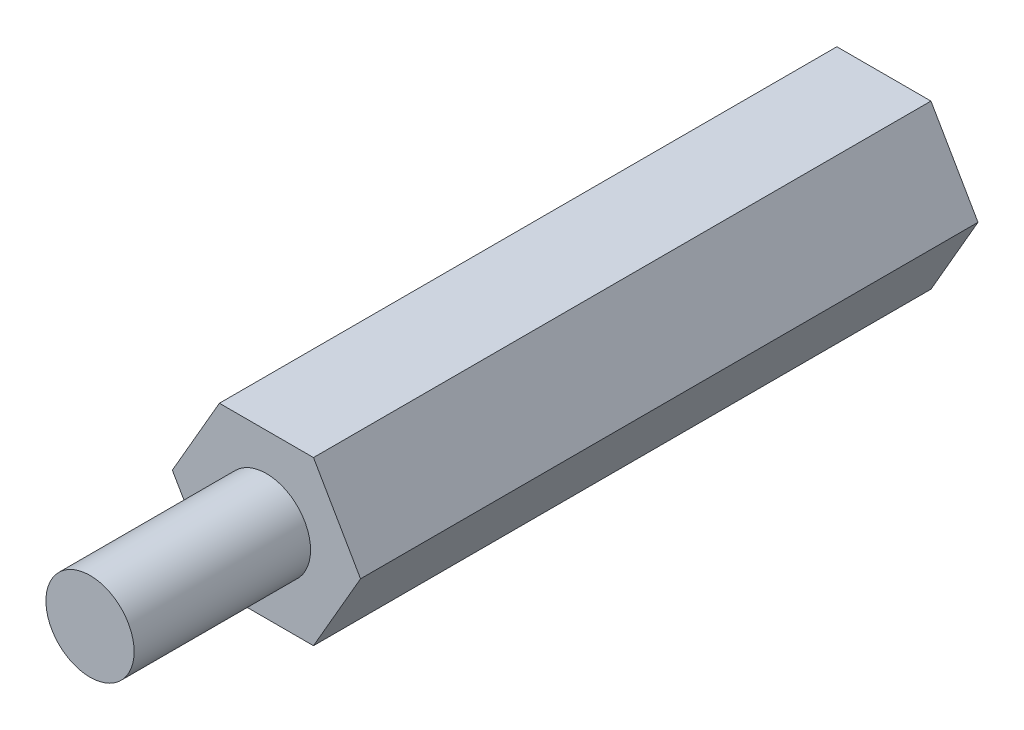
ISO-10303-21;
HEADER;
FILE_DESCRIPTION(('STEP AP214'),'2;1');
FILE_NAME('part.step','',(''),(''),'','','');
FILE_SCHEMA(('AUTOMOTIVE_DESIGN { 1 0 10303 214 1 1 1 1 }'));
ENDSEC;
DATA;
#1=APPLICATION_CONTEXT('core data for automotive mechanical design processes');
#2=APPLICATION_PROTOCOL_DEFINITION('international standard','automotive_design',2000,#1);
#3=PRODUCT_CONTEXT('',#1,'mechanical');
#4=PRODUCT('Part','Part','',(#3));
#5=PRODUCT_RELATED_PRODUCT_CATEGORY('part','',(#4));
#6=PRODUCT_DEFINITION_FORMATION('','',#4);
#7=PRODUCT_DEFINITION_CONTEXT('part definition',#1,'design');
#8=PRODUCT_DEFINITION('design','',#6,#7);
#9=PRODUCT_DEFINITION_SHAPE('','',#8);
#10=(LENGTH_UNIT() NAMED_UNIT(*) SI_UNIT(.MILLI.,.METRE.));
#11=(NAMED_UNIT(*) PLANE_ANGLE_UNIT() SI_UNIT($,.RADIAN.));
#12=(NAMED_UNIT(*) SI_UNIT($,.STERADIAN.) SOLID_ANGLE_UNIT());
#13=UNCERTAINTY_MEASURE_WITH_UNIT(LENGTH_MEASURE(1.E-05),#10,'distance_accuracy_value','');
#14=(GEOMETRIC_REPRESENTATION_CONTEXT(3) GLOBAL_UNCERTAINTY_ASSIGNED_CONTEXT((#13)) GLOBAL_UNIT_ASSIGNED_CONTEXT((#10,
#11,#12)) REPRESENTATION_CONTEXT('',''));
#15=CARTESIAN_POINT('',(0.,0.,0.));
#16=DIRECTION('',(0.,0.,1.));
#17=DIRECTION('',(1.,0.,0.));
#18=AXIS2_PLACEMENT_3D('',#15,#16,#17);
#19=CARTESIAN_POINT('',(3.2,0.,21.));
#20=DIRECTION('',(-0.866025403784439,-0.5,0.));
#21=DIRECTION('',(0.5,-0.866025403784439,0.));
#22=AXIS2_PLACEMENT_3D('',#19,#20,#21);
#23=PLANE('',#22);
#24=DIRECTION('',(-0.5,0.866025403784439,0.));
#25=VECTOR('',#24,1.);
#26=CARTESIAN_POINT('',(3.2,0.,0.));
#27=LINE('',#26,#25);
#28=CARTESIAN_POINT('',(3.2,0.,0.));
#29=VERTEX_POINT('',#28);
#30=CARTESIAN_POINT('',(1.6,2.7712812921102,0.));
#31=VERTEX_POINT('',#30);
#32=EDGE_CURVE('E120',#29,#31,#27,.T.);
#33=ORIENTED_EDGE('',*,*,#32,.T.);
#34=DIRECTION('',(0.,0.,-1.));
#35=VECTOR('',#34,1.);
#36=CARTESIAN_POINT('',(1.6,2.7712812921102,21.));
#37=LINE('',#36,#35);
#38=CARTESIAN_POINT('',(1.6,2.7712812921102,21.));
#39=VERTEX_POINT('',#38);
#40=EDGE_CURVE('E37',#39,#31,#37,.T.);
#41=ORIENTED_EDGE('',*,*,#40,.F.);
#42=DIRECTION('',(-0.5,0.866025403784439,0.));
#43=VECTOR('',#42,1.);
#44=CARTESIAN_POINT('',(3.2,0.,21.));
#45=LINE('',#44,#43);
#46=CARTESIAN_POINT('',(3.2,0.,21.));
#47=VERTEX_POINT('',#46);
#48=EDGE_CURVE('E131',#47,#39,#45,.T.);
#49=ORIENTED_EDGE('',*,*,#48,.F.);
#50=DIRECTION('',(0.,0.,-1.));
#51=VECTOR('',#50,1.);
#52=CARTESIAN_POINT('',(3.2,0.,21.));
#53=LINE('',#52,#51);
#54=EDGE_CURVE('E116',#47,#29,#53,.T.);
#55=ORIENTED_EDGE('',*,*,#54,.T.);
#56=EDGE_LOOP('',(#33,#41,#49,#55));
#57=FACE_BOUND('',#56,.T.);
#58=ADVANCED_FACE('F34',(#57),#23,.F.);
#59=CARTESIAN_POINT('',(1.6,2.7712812921102,21.));
#60=DIRECTION('',(0.,-1.,0.));
#61=DIRECTION('',(1.,0.,0.));
#62=AXIS2_PLACEMENT_3D('',#59,#60,#61);
#63=PLANE('',#62);
#64=DIRECTION('',(-1.,0.,0.));
#65=VECTOR('',#64,1.);
#66=CARTESIAN_POINT('',(1.6,2.7712812921102,0.));
#67=LINE('',#66,#65);
#68=CARTESIAN_POINT('',(-1.6,2.77128129211021,0.));
#69=VERTEX_POINT('',#68);
#70=EDGE_CURVE('E123',#31,#69,#67,.T.);
#71=ORIENTED_EDGE('',*,*,#70,.T.);
#72=DIRECTION('',(0.,0.,-1.));
#73=VECTOR('',#72,1.);
#74=CARTESIAN_POINT('',(-1.6,2.77128129211021,21.));
#75=LINE('',#74,#73);
#76=CARTESIAN_POINT('',(-1.6,2.77128129211021,21.));
#77=VERTEX_POINT('',#76);
#78=EDGE_CURVE('E134',#77,#69,#75,.T.);
#79=ORIENTED_EDGE('',*,*,#78,.F.);
#80=DIRECTION('',(-1.,0.,0.));
#81=VECTOR('',#80,1.);
#82=CARTESIAN_POINT('',(1.6,2.7712812921102,21.));
#83=LINE('',#82,#81);
#84=EDGE_CURVE('E89',#39,#77,#83,.T.);
#85=ORIENTED_EDGE('',*,*,#84,.F.);
#86=ORIENTED_EDGE('',*,*,#40,.T.);
#87=EDGE_LOOP('',(#71,#79,#85,#86));
#88=FACE_BOUND('',#87,.T.);
#89=ADVANCED_FACE('F139',(#88),#63,.F.);
#90=CARTESIAN_POINT('',(-1.6,2.77128129211021,21.));
#91=DIRECTION('',(0.866025403784439,-0.5,0.));
#92=DIRECTION('',(0.5,0.866025403784439,0.));
#93=AXIS2_PLACEMENT_3D('',#90,#91,#92);
#94=PLANE('',#93);
#95=DIRECTION('',(-0.5,-0.866025403784439,0.));
#96=VECTOR('',#95,1.);
#97=CARTESIAN_POINT('',(-1.6,2.77128129211021,0.));
#98=LINE('',#97,#96);
#99=CARTESIAN_POINT('',(-3.2,0.,0.));
#100=VERTEX_POINT('',#99);
#101=EDGE_CURVE('E126',#69,#100,#98,.T.);
#102=ORIENTED_EDGE('',*,*,#101,.T.);
#103=DIRECTION('',(0.,0.,-1.));
#104=VECTOR('',#103,1.);
#105=CARTESIAN_POINT('',(-3.2,0.,21.));
#106=LINE('',#105,#104);
#107=CARTESIAN_POINT('',(-3.2,0.,21.));
#108=VERTEX_POINT('',#107);
#109=EDGE_CURVE('E111',#108,#100,#106,.T.);
#110=ORIENTED_EDGE('',*,*,#109,.F.);
#111=DIRECTION('',(-0.5,-0.866025403784439,0.));
#112=VECTOR('',#111,1.);
#113=CARTESIAN_POINT('',(-1.6,2.77128129211021,21.));
#114=LINE('',#113,#112);
#115=EDGE_CURVE('E102',#77,#108,#114,.T.);
#116=ORIENTED_EDGE('',*,*,#115,.F.);
#117=ORIENTED_EDGE('',*,*,#78,.T.);
#118=EDGE_LOOP('',(#102,#110,#116,#117));
#119=FACE_BOUND('',#118,.T.);
#120=ADVANCED_FACE('F145',(#119),#94,.F.);
#121=CARTESIAN_POINT('',(-3.2,0.,21.));
#122=DIRECTION('',(0.866025403784439,0.5,0.));
#123=DIRECTION('',(-0.5,0.866025403784439,0.));
#124=AXIS2_PLACEMENT_3D('',#121,#122,#123);
#125=PLANE('',#124);
#126=DIRECTION('',(0.5,-0.866025403784439,0.));
#127=VECTOR('',#126,1.);
#128=CARTESIAN_POINT('',(-3.2,0.,0.));
#129=LINE('',#128,#127);
#130=CARTESIAN_POINT('',(-1.6,-2.7712812921102,0.));
#131=VERTEX_POINT('',#130);
#132=EDGE_CURVE('E110',#100,#131,#129,.T.);
#133=ORIENTED_EDGE('',*,*,#132,.T.);
#134=DIRECTION('',(0.,0.,-1.));
#135=VECTOR('',#134,1.);
#136=CARTESIAN_POINT('',(-1.6,-2.7712812921102,21.));
#137=LINE('',#136,#135);
#138=CARTESIAN_POINT('',(-1.6,-2.7712812921102,21.));
#139=VERTEX_POINT('',#138);
#140=EDGE_CURVE('E107',#139,#131,#137,.T.);
#141=ORIENTED_EDGE('',*,*,#140,.F.);
#142=DIRECTION('',(0.5,-0.866025403784439,0.));
#143=VECTOR('',#142,1.);
#144=CARTESIAN_POINT('',(-3.2,0.,21.));
#145=LINE('',#144,#143);
#146=EDGE_CURVE('E96',#108,#139,#145,.T.);
#147=ORIENTED_EDGE('',*,*,#146,.F.);
#148=ORIENTED_EDGE('',*,*,#109,.T.);
#149=EDGE_LOOP('',(#133,#141,#147,#148));
#150=FACE_BOUND('',#149,.T.);
#151=ADVANCED_FACE('F108',(#150),#125,.F.);
#152=CARTESIAN_POINT('',(-1.6,-2.7712812921102,21.));
#153=DIRECTION('',(0.,1.,0.));
#154=DIRECTION('',(-1.,0.,0.));
#155=AXIS2_PLACEMENT_3D('',#152,#153,#154);
#156=PLANE('',#155);
#157=DIRECTION('',(1.,0.,0.));
#158=VECTOR('',#157,1.);
#159=CARTESIAN_POINT('',(-1.6,-2.7712812921102,0.));
#160=LINE('',#159,#158);
#161=CARTESIAN_POINT('',(1.6,-2.7712812921102,0.));
#162=VERTEX_POINT('',#161);
#163=EDGE_CURVE('E74',#131,#162,#160,.T.);
#164=ORIENTED_EDGE('',*,*,#163,.T.);
#165=DIRECTION('',(0.,0.,-1.));
#166=VECTOR('',#165,1.);
#167=CARTESIAN_POINT('',(1.6,-2.7712812921102,21.));
#168=LINE('',#167,#166);
#169=CARTESIAN_POINT('',(1.6,-2.7712812921102,21.));
#170=VERTEX_POINT('',#169);
#171=EDGE_CURVE('E112',#170,#162,#168,.T.);
#172=ORIENTED_EDGE('',*,*,#171,.F.);
#173=DIRECTION('',(1.,0.,0.));
#174=VECTOR('',#173,1.);
#175=CARTESIAN_POINT('',(-1.6,-2.7712812921102,21.));
#176=LINE('',#175,#174);
#177=EDGE_CURVE('E100',#139,#170,#176,.T.);
#178=ORIENTED_EDGE('',*,*,#177,.F.);
#179=ORIENTED_EDGE('',*,*,#140,.T.);
#180=EDGE_LOOP('',(#164,#172,#178,#179));
#181=FACE_BOUND('',#180,.T.);
#182=ADVANCED_FACE('F114',(#181),#156,.F.);
#183=CARTESIAN_POINT('',(1.6,-2.7712812921102,21.));
#184=DIRECTION('',(-0.866025403784439,0.5,0.));
#185=DIRECTION('',(-0.5,-0.866025403784439,0.));
#186=AXIS2_PLACEMENT_3D('',#183,#184,#185);
#187=PLANE('',#186);
#188=DIRECTION('',(0.5,0.866025403784439,0.));
#189=VECTOR('',#188,1.);
#190=CARTESIAN_POINT('',(1.6,-2.7712812921102,0.));
#191=LINE('',#190,#189);
#192=EDGE_CURVE('E80',#162,#29,#191,.T.);
#193=ORIENTED_EDGE('',*,*,#192,.T.);
#194=ORIENTED_EDGE('',*,*,#54,.F.);
#195=DIRECTION('',(0.5,0.866025403784439,0.));
#196=VECTOR('',#195,1.);
#197=CARTESIAN_POINT('',(1.6,-2.7712812921102,21.));
#198=LINE('',#197,#196);
#199=EDGE_CURVE('E51',#170,#47,#198,.T.);
#200=ORIENTED_EDGE('',*,*,#199,.F.);
#201=ORIENTED_EDGE('',*,*,#171,.T.);
#202=EDGE_LOOP('',(#193,#194,#200,#201));
#203=FACE_BOUND('',#202,.T.);
#204=ADVANCED_FACE('F168',(#203),#187,.F.);
#205=CARTESIAN_POINT('',(0.,0.,21.));
#206=DIRECTION('',(0.,0.,1.));
#207=DIRECTION('',(1.,0.,0.));
#208=AXIS2_PLACEMENT_3D('',#205,#206,#207);
#209=PLANE('',#208);
#210=CARTESIAN_POINT('',(0.,0.,21.));
#211=DIRECTION('',(0.,0.,1.));
#212=DIRECTION('',(1.,0.,0.));
#213=AXIS2_PLACEMENT_3D('',#210,#211,#212);
#214=CIRCLE('',#213,1.5);
#215=CARTESIAN_POINT('',(1.5,0.,21.));
#216=VERTEX_POINT('',#215);
#217=EDGE_CURVE('E11',#216,#216,#214,.T.);
#218=ORIENTED_EDGE('',*,*,#217,.F.);
#219=EDGE_LOOP('',(#218));
#220=FACE_BOUND('',#219,.T.);
#221=ORIENTED_EDGE('',*,*,#48,.T.);
#222=ORIENTED_EDGE('',*,*,#84,.T.);
#223=ORIENTED_EDGE('',*,*,#115,.T.);
#224=ORIENTED_EDGE('',*,*,#146,.T.);
#225=ORIENTED_EDGE('',*,*,#177,.T.);
#226=ORIENTED_EDGE('',*,*,#199,.T.);
#227=EDGE_LOOP('',(#221,#222,#223,#224,#225,#226));
#228=FACE_BOUND('',#227,.T.);
#229=ADVANCED_FACE('F98',(#220,#228),#209,.T.);
#230=CARTESIAN_POINT('',(0.,0.,0.));
#231=DIRECTION('',(0.,0.,1.));
#232=DIRECTION('',(1.,0.,0.));
#233=AXIS2_PLACEMENT_3D('',#230,#231,#232);
#234=PLANE('',#233);
#235=CARTESIAN_POINT('',(0.,0.,0.));
#236=DIRECTION('',(0.,0.,-1.));
#237=DIRECTION('',(-1.,0.,0.));
#238=AXIS2_PLACEMENT_3D('',#235,#236,#237);
#239=CIRCLE('',#238,1.5);
#240=CARTESIAN_POINT('',(-1.5,0.,0.));
#241=VERTEX_POINT('',#240);
#242=EDGE_CURVE('E149',#241,#241,#239,.T.);
#243=ORIENTED_EDGE('',*,*,#242,.F.);
#244=EDGE_LOOP('',(#243));
#245=FACE_BOUND('',#244,.T.);
#246=ORIENTED_EDGE('',*,*,#32,.F.);
#247=ORIENTED_EDGE('',*,*,#192,.F.);
#248=ORIENTED_EDGE('',*,*,#163,.F.);
#249=ORIENTED_EDGE('',*,*,#132,.F.);
#250=ORIENTED_EDGE('',*,*,#101,.F.);
#251=ORIENTED_EDGE('',*,*,#70,.F.);
#252=EDGE_LOOP('',(#246,#247,#248,#249,#250,#251));
#253=FACE_BOUND('',#252,.T.);
#254=ADVANCED_FACE('F144',(#245,#253),#234,.F.);
#255=CARTESIAN_POINT('',(0.,0.,6.));
#256=DIRECTION('',(0.,0.,-1.));
#257=DIRECTION('',(-1.,0.,0.));
#258=AXIS2_PLACEMENT_3D('',#255,#256,#257);
#259=CYLINDRICAL_SURFACE('',#258,1.5);
#260=CARTESIAN_POINT('',(0.,0.,6.));
#261=DIRECTION('',(0.,0.,-1.));
#262=DIRECTION('',(-1.,0.,0.));
#263=AXIS2_PLACEMENT_3D('',#260,#261,#262);
#264=CIRCLE('',#263,1.5);
#265=CARTESIAN_POINT('',(-1.5,0.,6.));
#266=VERTEX_POINT('',#265);
#267=EDGE_CURVE('E124',#266,#266,#264,.T.);
#268=ORIENTED_EDGE('',*,*,#267,.F.);
#269=EDGE_LOOP('',(#268));
#270=FACE_BOUND('',#269,.T.);
#271=ORIENTED_EDGE('',*,*,#242,.T.);
#272=EDGE_LOOP('',(#271));
#273=FACE_BOUND('',#272,.T.);
#274=ADVANCED_FACE('F174',(#270,#273),#259,.F.);
#275=CARTESIAN_POINT('',(0.,0.,6.));
#276=DIRECTION('',(0.,0.,-1.));
#277=DIRECTION('',(-1.,0.,0.));
#278=AXIS2_PLACEMENT_3D('',#275,#276,#277);
#279=PLANE('',#278);
#280=ORIENTED_EDGE('',*,*,#267,.T.);
#281=EDGE_LOOP('',(#280));
#282=FACE_BOUND('',#281,.T.);
#283=ADVANCED_FACE('F163',(#282),#279,.T.);
#284=CARTESIAN_POINT('',(0.,0.,27.));
#285=DIRECTION('',(0.,0.,-1.));
#286=DIRECTION('',(-1.,0.,0.));
#287=AXIS2_PLACEMENT_3D('',#284,#285,#286);
#288=CYLINDRICAL_SURFACE('',#287,1.5);
#289=CARTESIAN_POINT('',(0.,0.,27.));
#290=DIRECTION('',(0.,0.,1.));
#291=DIRECTION('',(1.,0.,0.));
#292=AXIS2_PLACEMENT_3D('',#289,#290,#291);
#293=CIRCLE('',#292,1.5);
#294=CARTESIAN_POINT('',(1.5,0.,27.));
#295=VERTEX_POINT('',#294);
#296=EDGE_CURVE('E152',#295,#295,#293,.T.);
#297=ORIENTED_EDGE('',*,*,#296,.F.);
#298=EDGE_LOOP('',(#297));
#299=FACE_BOUND('',#298,.T.);
#300=ORIENTED_EDGE('',*,*,#217,.T.);
#301=EDGE_LOOP('',(#300));
#302=FACE_BOUND('',#301,.T.);
#303=ADVANCED_FACE('F160',(#299,#302),#288,.T.);
#304=CARTESIAN_POINT('',(0.,0.,27.));
#305=DIRECTION('',(0.,0.,1.));
#306=DIRECTION('',(1.,0.,0.));
#307=AXIS2_PLACEMENT_3D('',#304,#305,#306);
#308=PLANE('',#307);
#309=ORIENTED_EDGE('',*,*,#296,.T.);
#310=EDGE_LOOP('',(#309));
#311=FACE_BOUND('',#310,.T.);
#312=ADVANCED_FACE('F158',(#311),#308,.T.);
#313=CLOSED_SHELL('',(#58,#89,#120,#151,#182,#204,#229,#254,#274,#283,#303,#312));
#314=MANIFOLD_SOLID_BREP('B2',#313);
#315=ADVANCED_BREP_SHAPE_REPRESENTATION('',(#18,#314),#14);
#316=SHAPE_DEFINITION_REPRESENTATION(#9,#315);
ENDSEC;
END-ISO-10303-21;
